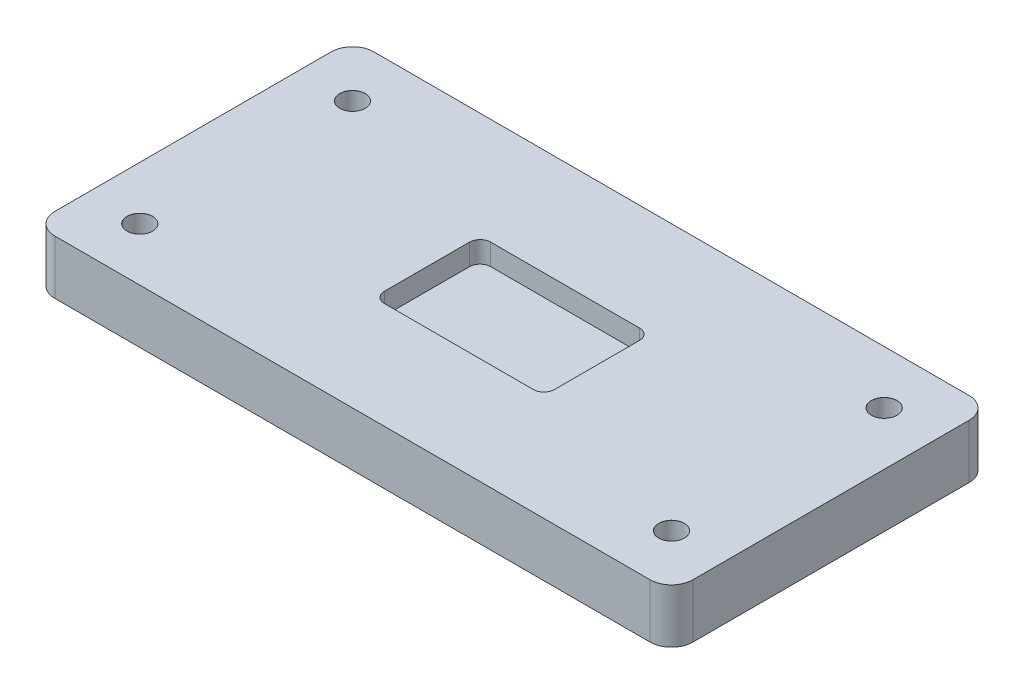
ISO-10303-21;
HEADER;
FILE_DESCRIPTION(('STEP AP214'),'2;1');
FILE_NAME('part.step','',(''),(''),'','','');
FILE_SCHEMA(('AUTOMOTIVE_DESIGN { 1 0 10303 214 1 1 1 1 }'));
ENDSEC;
DATA;
#1=APPLICATION_CONTEXT('core data for automotive mechanical design processes');
#2=APPLICATION_PROTOCOL_DEFINITION('international standard','automotive_design',2000,#1);
#3=PRODUCT_CONTEXT('',#1,'mechanical');
#4=PRODUCT('Part','Part','',(#3));
#5=PRODUCT_RELATED_PRODUCT_CATEGORY('part','',(#4));
#6=PRODUCT_DEFINITION_FORMATION('','',#4);
#7=PRODUCT_DEFINITION_CONTEXT('part definition',#1,'design');
#8=PRODUCT_DEFINITION('design','',#6,#7);
#9=PRODUCT_DEFINITION_SHAPE('','',#8);
#10=(LENGTH_UNIT() NAMED_UNIT(*) SI_UNIT(.MILLI.,.METRE.));
#11=(NAMED_UNIT(*) PLANE_ANGLE_UNIT() SI_UNIT($,.RADIAN.));
#12=(NAMED_UNIT(*) SI_UNIT($,.STERADIAN.) SOLID_ANGLE_UNIT());
#13=UNCERTAINTY_MEASURE_WITH_UNIT(LENGTH_MEASURE(1.E-05),#10,'distance_accuracy_value','');
#14=(GEOMETRIC_REPRESENTATION_CONTEXT(3) GLOBAL_UNCERTAINTY_ASSIGNED_CONTEXT((#13)) GLOBAL_UNIT_ASSIGNED_CONTEXT((#10,
#11,#12)) REPRESENTATION_CONTEXT('',''));
#15=CARTESIAN_POINT('',(0.,0.,0.));
#16=DIRECTION('',(0.,0.,1.));
#17=DIRECTION('',(1.,0.,0.));
#18=AXIS2_PLACEMENT_3D('',#15,#16,#17);
#19=CARTESIAN_POINT('',(140.,25.4,65.));
#20=DIRECTION('',(0.,-1.,0.));
#21=DIRECTION('',(0.,0.,-1.));
#22=AXIS2_PLACEMENT_3D('',#19,#20,#21);
#23=CYLINDRICAL_SURFACE('',#22,9.99999999999999);
#24=CARTESIAN_POINT('',(140.,0.,65.));
#25=DIRECTION('',(0.,1.,0.));
#26=DIRECTION('',(0.,0.,-1.));
#27=AXIS2_PLACEMENT_3D('',#24,#25,#26);
#28=CIRCLE('',#27,9.99999999999999);
#29=CARTESIAN_POINT('',(140.,0.,75.));
#30=VERTEX_POINT('',#29);
#31=CARTESIAN_POINT('',(150.,0.,64.9999999999999));
#32=VERTEX_POINT('',#31);
#33=EDGE_CURVE('E182',#30,#32,#28,.T.);
#34=ORIENTED_EDGE('',*,*,#33,.T.);
#35=DIRECTION('',(0.,-1.,0.));
#36=VECTOR('',#35,1.);
#37=CARTESIAN_POINT('',(150.,25.4,64.9999999999999));
#38=LINE('',#37,#36);
#39=CARTESIAN_POINT('',(150.,25.4,64.9999999999999));
#40=VERTEX_POINT('',#39);
#41=EDGE_CURVE('E163',#40,#32,#38,.T.);
#42=ORIENTED_EDGE('',*,*,#41,.F.);
#43=CARTESIAN_POINT('',(140.,25.4,65.));
#44=DIRECTION('',(0.,1.,0.));
#45=DIRECTION('',(0.,0.,-1.));
#46=AXIS2_PLACEMENT_3D('',#43,#44,#45);
#47=CIRCLE('',#46,9.99999999999999);
#48=CARTESIAN_POINT('',(140.,25.4,75.));
#49=VERTEX_POINT('',#48);
#50=EDGE_CURVE('E170',#49,#40,#47,.T.);
#51=ORIENTED_EDGE('',*,*,#50,.F.);
#52=DIRECTION('',(0.,-1.,0.));
#53=VECTOR('',#52,1.);
#54=CARTESIAN_POINT('',(140.,25.4,75.));
#55=LINE('',#54,#53);
#56=EDGE_CURVE('E272',#49,#30,#55,.T.);
#57=ORIENTED_EDGE('',*,*,#56,.T.);
#58=EDGE_LOOP('',(#34,#42,#51,#57));
#59=FACE_BOUND('',#58,.T.);
#60=ADVANCED_FACE('F47',(#59),#23,.T.);
#61=CARTESIAN_POINT('',(150.,25.4,-64.9999999999999));
#62=DIRECTION('',(-1.,0.,0.));
#63=DIRECTION('',(0.,0.,1.));
#64=AXIS2_PLACEMENT_3D('',#61,#62,#63);
#65=PLANE('',#64);
#66=DIRECTION('',(0.,0.,-1.));
#67=VECTOR('',#66,1.);
#68=CARTESIAN_POINT('',(150.,0.,-64.9999999999999));
#69=LINE('',#68,#67);
#70=CARTESIAN_POINT('',(150.,0.,-64.9999999999999));
#71=VERTEX_POINT('',#70);
#72=EDGE_CURVE('E274',#32,#71,#69,.T.);
#73=ORIENTED_EDGE('',*,*,#72,.T.);
#74=DIRECTION('',(0.,-1.,0.));
#75=VECTOR('',#74,1.);
#76=CARTESIAN_POINT('',(150.,25.4,-64.9999999999999));
#77=LINE('',#76,#75);
#78=CARTESIAN_POINT('',(150.,25.4,-64.9999999999999));
#79=VERTEX_POINT('',#78);
#80=EDGE_CURVE('E166',#79,#71,#77,.T.);
#81=ORIENTED_EDGE('',*,*,#80,.F.);
#82=DIRECTION('',(0.,0.,-1.));
#83=VECTOR('',#82,1.);
#84=CARTESIAN_POINT('',(150.,25.4,-64.9999999999999));
#85=LINE('',#84,#83);
#86=EDGE_CURVE('E159',#40,#79,#85,.T.);
#87=ORIENTED_EDGE('',*,*,#86,.F.);
#88=ORIENTED_EDGE('',*,*,#41,.T.);
#89=EDGE_LOOP('',(#73,#81,#87,#88));
#90=FACE_BOUND('',#89,.T.);
#91=ADVANCED_FACE('F161',(#90),#65,.F.);
#92=CARTESIAN_POINT('',(140.,25.4,-65.));
#93=DIRECTION('',(0.,-1.,0.));
#94=DIRECTION('',(0.,0.,-1.));
#95=AXIS2_PLACEMENT_3D('',#92,#93,#94);
#96=CYLINDRICAL_SURFACE('',#95,10.);
#97=CARTESIAN_POINT('',(140.,0.,-65.));
#98=DIRECTION('',(0.,1.,0.));
#99=DIRECTION('',(0.,0.,1.));
#100=AXIS2_PLACEMENT_3D('',#97,#98,#99);
#101=CIRCLE('',#100,10.);
#102=CARTESIAN_POINT('',(140.,0.,-75.));
#103=VERTEX_POINT('',#102);
#104=EDGE_CURVE('E276',#71,#103,#101,.T.);
#105=ORIENTED_EDGE('',*,*,#104,.T.);
#106=DIRECTION('',(0.,-1.,0.));
#107=VECTOR('',#106,1.);
#108=CARTESIAN_POINT('',(140.,25.4,-75.));
#109=LINE('',#108,#107);
#110=CARTESIAN_POINT('',(140.,25.4,-75.));
#111=VERTEX_POINT('',#110);
#112=EDGE_CURVE('E187',#111,#103,#109,.T.);
#113=ORIENTED_EDGE('',*,*,#112,.F.);
#114=CARTESIAN_POINT('',(140.,25.4,-65.));
#115=DIRECTION('',(0.,1.,0.));
#116=DIRECTION('',(0.,0.,1.));
#117=AXIS2_PLACEMENT_3D('',#114,#115,#116);
#118=CIRCLE('',#117,10.);
#119=EDGE_CURVE('E169',#79,#111,#118,.T.);
#120=ORIENTED_EDGE('',*,*,#119,.F.);
#121=ORIENTED_EDGE('',*,*,#80,.T.);
#122=EDGE_LOOP('',(#105,#113,#120,#121));
#123=FACE_BOUND('',#122,.T.);
#124=ADVANCED_FACE('F323',(#123),#96,.T.);
#125=CARTESIAN_POINT('',(-140.,25.4,-75.));
#126=DIRECTION('',(0.,0.,1.));
#127=DIRECTION('',(1.,0.,0.));
#128=AXIS2_PLACEMENT_3D('',#125,#126,#127);
#129=PLANE('',#128);
#130=DIRECTION('',(-1.,0.,0.));
#131=VECTOR('',#130,1.);
#132=CARTESIAN_POINT('',(-140.,0.,-75.));
#133=LINE('',#132,#131);
#134=CARTESIAN_POINT('',(-140.,0.,-75.));
#135=VERTEX_POINT('',#134);
#136=EDGE_CURVE('E278',#103,#135,#133,.T.);
#137=ORIENTED_EDGE('',*,*,#136,.T.);
#138=DIRECTION('',(0.,-1.,0.));
#139=VECTOR('',#138,1.);
#140=CARTESIAN_POINT('',(-140.,25.4,-75.));
#141=LINE('',#140,#139);
#142=CARTESIAN_POINT('',(-140.,25.4,-75.));
#143=VERTEX_POINT('',#142);
#144=EDGE_CURVE('E297',#143,#135,#141,.T.);
#145=ORIENTED_EDGE('',*,*,#144,.F.);
#146=DIRECTION('',(-1.,0.,0.));
#147=VECTOR('',#146,1.);
#148=CARTESIAN_POINT('',(-140.,25.4,-75.));
#149=LINE('',#148,#147);
#150=EDGE_CURVE('E263',#111,#143,#149,.T.);
#151=ORIENTED_EDGE('',*,*,#150,.F.);
#152=ORIENTED_EDGE('',*,*,#112,.T.);
#153=EDGE_LOOP('',(#137,#145,#151,#152));
#154=FACE_BOUND('',#153,.T.);
#155=ADVANCED_FACE('F304',(#154),#129,.F.);
#156=CARTESIAN_POINT('',(-140.,25.4,-65.));
#157=DIRECTION('',(0.,-1.,0.));
#158=DIRECTION('',(0.,0.,-1.));
#159=AXIS2_PLACEMENT_3D('',#156,#157,#158);
#160=CYLINDRICAL_SURFACE('',#159,10.);
#161=CARTESIAN_POINT('',(-140.,0.,-65.));
#162=DIRECTION('',(0.,1.,0.));
#163=DIRECTION('',(0.,0.,-1.));
#164=AXIS2_PLACEMENT_3D('',#161,#162,#163);
#165=CIRCLE('',#164,10.);
#166=CARTESIAN_POINT('',(-150.,0.,-64.9999999999999));
#167=VERTEX_POINT('',#166);
#168=EDGE_CURVE('E280',#135,#167,#165,.T.);
#169=ORIENTED_EDGE('',*,*,#168,.T.);
#170=DIRECTION('',(0.,-1.,0.));
#171=VECTOR('',#170,1.);
#172=CARTESIAN_POINT('',(-150.,25.4,-64.9999999999999));
#173=LINE('',#172,#171);
#174=CARTESIAN_POINT('',(-150.,25.4,-64.9999999999999));
#175=VERTEX_POINT('',#174);
#176=EDGE_CURVE('E294',#175,#167,#173,.T.);
#177=ORIENTED_EDGE('',*,*,#176,.F.);
#178=CARTESIAN_POINT('',(-140.,25.4,-65.));
#179=DIRECTION('',(0.,1.,0.));
#180=DIRECTION('',(0.,0.,-1.));
#181=AXIS2_PLACEMENT_3D('',#178,#179,#180);
#182=CIRCLE('',#181,10.);
#183=EDGE_CURVE('E265',#143,#175,#182,.T.);
#184=ORIENTED_EDGE('',*,*,#183,.F.);
#185=ORIENTED_EDGE('',*,*,#144,.T.);
#186=EDGE_LOOP('',(#169,#177,#184,#185));
#187=FACE_BOUND('',#186,.T.);
#188=ADVANCED_FACE('F315',(#187),#160,.T.);
#189=CARTESIAN_POINT('',(-150.,25.4,-64.9999999999999));
#190=DIRECTION('',(1.,0.,0.));
#191=DIRECTION('',(0.,0.,-1.));
#192=AXIS2_PLACEMENT_3D('',#189,#190,#191);
#193=PLANE('',#192);
#194=DIRECTION('',(0.,0.,1.));
#195=VECTOR('',#194,1.);
#196=CARTESIAN_POINT('',(-150.,0.,-64.9999999999999));
#197=LINE('',#196,#195);
#198=CARTESIAN_POINT('',(-150.,0.,65.));
#199=VERTEX_POINT('',#198);
#200=EDGE_CURVE('E282',#167,#199,#197,.T.);
#201=ORIENTED_EDGE('',*,*,#200,.T.);
#202=DIRECTION('',(0.,-1.,0.));
#203=VECTOR('',#202,1.);
#204=CARTESIAN_POINT('',(-150.,25.4,65.));
#205=LINE('',#204,#203);
#206=CARTESIAN_POINT('',(-150.,25.4,65.));
#207=VERTEX_POINT('',#206);
#208=EDGE_CURVE('E291',#207,#199,#205,.T.);
#209=ORIENTED_EDGE('',*,*,#208,.F.);
#210=DIRECTION('',(0.,0.,1.));
#211=VECTOR('',#210,1.);
#212=CARTESIAN_POINT('',(-150.,25.4,-64.9999999999999));
#213=LINE('',#212,#211);
#214=EDGE_CURVE('E267',#175,#207,#213,.T.);
#215=ORIENTED_EDGE('',*,*,#214,.F.);
#216=ORIENTED_EDGE('',*,*,#176,.T.);
#217=EDGE_LOOP('',(#201,#209,#215,#216));
#218=FACE_BOUND('',#217,.T.);
#219=ADVANCED_FACE('F319',(#218),#193,.F.);
#220=CARTESIAN_POINT('',(-140.,25.4,65.));
#221=DIRECTION('',(0.,-1.,0.));
#222=DIRECTION('',(0.,0.,-1.));
#223=AXIS2_PLACEMENT_3D('',#220,#221,#222);
#224=CYLINDRICAL_SURFACE('',#223,10.);
#225=CARTESIAN_POINT('',(-140.,0.,65.));
#226=DIRECTION('',(0.,1.,0.));
#227=DIRECTION('',(0.,0.,-1.));
#228=AXIS2_PLACEMENT_3D('',#225,#226,#227);
#229=CIRCLE('',#228,10.);
#230=CARTESIAN_POINT('',(-140.,0.,75.));
#231=VERTEX_POINT('',#230);
#232=EDGE_CURVE('E284',#199,#231,#229,.T.);
#233=ORIENTED_EDGE('',*,*,#232,.T.);
#234=DIRECTION('',(0.,-1.,0.));
#235=VECTOR('',#234,1.);
#236=CARTESIAN_POINT('',(-140.,25.4,75.));
#237=LINE('',#236,#235);
#238=CARTESIAN_POINT('',(-140.,25.4,75.));
#239=VERTEX_POINT('',#238);
#240=EDGE_CURVE('E288',#239,#231,#237,.T.);
#241=ORIENTED_EDGE('',*,*,#240,.F.);
#242=CARTESIAN_POINT('',(-140.,25.4,65.));
#243=DIRECTION('',(0.,1.,0.));
#244=DIRECTION('',(0.,0.,-1.));
#245=AXIS2_PLACEMENT_3D('',#242,#243,#244);
#246=CIRCLE('',#245,10.);
#247=EDGE_CURVE('E269',#207,#239,#246,.T.);
#248=ORIENTED_EDGE('',*,*,#247,.F.);
#249=ORIENTED_EDGE('',*,*,#208,.T.);
#250=EDGE_LOOP('',(#233,#241,#248,#249));
#251=FACE_BOUND('',#250,.T.);
#252=ADVANCED_FACE('F378',(#251),#224,.T.);
#253=CARTESIAN_POINT('',(-140.,25.4,75.));
#254=DIRECTION('',(0.,0.,-1.));
#255=DIRECTION('',(-1.,0.,0.));
#256=AXIS2_PLACEMENT_3D('',#253,#254,#255);
#257=PLANE('',#256);
#258=DIRECTION('',(1.,0.,0.));
#259=VECTOR('',#258,1.);
#260=CARTESIAN_POINT('',(-140.,0.,75.));
#261=LINE('',#260,#259);
#262=EDGE_CURVE('E179',#231,#30,#261,.T.);
#263=ORIENTED_EDGE('',*,*,#262,.T.);
#264=ORIENTED_EDGE('',*,*,#56,.F.);
#265=DIRECTION('',(1.,0.,0.));
#266=VECTOR('',#265,1.);
#267=CARTESIAN_POINT('',(-140.,25.4,75.));
#268=LINE('',#267,#266);
#269=EDGE_CURVE('E175',#239,#49,#268,.T.);
#270=ORIENTED_EDGE('',*,*,#269,.F.);
#271=ORIENTED_EDGE('',*,*,#240,.T.);
#272=EDGE_LOOP('',(#263,#264,#270,#271));
#273=FACE_BOUND('',#272,.T.);
#274=ADVANCED_FACE('F371',(#273),#257,.F.);
#275=CARTESIAN_POINT('',(140.,25.4,65.));
#276=DIRECTION('',(0.,-1.,0.));
#277=DIRECTION('',(0.,0.,-1.));
#278=AXIS2_PLACEMENT_3D('',#275,#276,#277);
#279=PLANE('',#278);
#280=CARTESIAN_POINT('',(-125.,25.4,-50.));
#281=DIRECTION('',(0.,1.,0.));
#282=DIRECTION('',(0.,0.,1.));
#283=AXIS2_PLACEMENT_3D('',#280,#281,#282);
#284=CIRCLE('',#283,6.025);
#285=CARTESIAN_POINT('',(-125.,25.4,-43.975));
#286=VERTEX_POINT('',#285);
#287=EDGE_CURVE('E682',#286,#286,#284,.T.);
#288=ORIENTED_EDGE('',*,*,#287,.F.);
#289=EDGE_LOOP('',(#288));
#290=FACE_BOUND('',#289,.T.);
#291=CARTESIAN_POINT('',(125.,25.4,-49.9999999999998));
#292=DIRECTION('',(0.,1.,0.));
#293=DIRECTION('',(0.,0.,1.));
#294=AXIS2_PLACEMENT_3D('',#291,#292,#293);
#295=CIRCLE('',#294,6.025);
#296=CARTESIAN_POINT('',(125.,25.4,-43.9749999999998));
#297=VERTEX_POINT('',#296);
#298=EDGE_CURVE('E673',#297,#297,#295,.T.);
#299=ORIENTED_EDGE('',*,*,#298,.F.);
#300=EDGE_LOOP('',(#299));
#301=FACE_BOUND('',#300,.T.);
#302=CARTESIAN_POINT('',(125.,25.4,49.9999999999998));
#303=DIRECTION('',(0.,1.,0.));
#304=DIRECTION('',(0.,0.,1.));
#305=AXIS2_PLACEMENT_3D('',#302,#303,#304);
#306=CIRCLE('',#305,6.025);
#307=CARTESIAN_POINT('',(125.,25.4,56.0249999999998));
#308=VERTEX_POINT('',#307);
#309=EDGE_CURVE('E664',#308,#308,#306,.T.);
#310=ORIENTED_EDGE('',*,*,#309,.F.);
#311=EDGE_LOOP('',(#310));
#312=FACE_BOUND('',#311,.T.);
#313=CARTESIAN_POINT('',(-125.,25.4,49.9999999999999));
#314=DIRECTION('',(0.,1.,0.));
#315=DIRECTION('',(0.,0.,1.));
#316=AXIS2_PLACEMENT_3D('',#313,#314,#315);
#317=CIRCLE('',#316,6.025);
#318=CARTESIAN_POINT('',(-125.,25.4,56.0249999999999));
#319=VERTEX_POINT('',#318);
#320=EDGE_CURVE('E654',#319,#319,#317,.T.);
#321=ORIENTED_EDGE('',*,*,#320,.F.);
#322=EDGE_LOOP('',(#321));
#323=FACE_BOUND('',#322,.T.);
#324=DIRECTION('',(-1.,0.,0.));
#325=VECTOR('',#324,1.);
#326=CARTESIAN_POINT('',(-40.,25.4,-25.));
#327=LINE('',#326,#325);
#328=CARTESIAN_POINT('',(35.,25.4,-25.));
#329=VERTEX_POINT('',#328);
#330=CARTESIAN_POINT('',(-35.,25.4,-25.));
#331=VERTEX_POINT('',#330);
#332=EDGE_CURVE('E258',#329,#331,#327,.T.);
#333=ORIENTED_EDGE('',*,*,#332,.F.);
#334=CARTESIAN_POINT('',(35.,25.4,-20.));
#335=DIRECTION('',(0.,-1.,0.));
#336=DIRECTION('',(0.,0.,-1.));
#337=AXIS2_PLACEMENT_3D('',#334,#335,#336);
#338=CIRCLE('',#337,5.);
#339=CARTESIAN_POINT('',(40.,25.4,-20.));
#340=VERTEX_POINT('',#339);
#341=EDGE_CURVE('E11',#329,#340,#338,.T.);
#342=ORIENTED_EDGE('',*,*,#341,.T.);
#343=DIRECTION('',(0.,0.,-1.));
#344=VECTOR('',#343,1.);
#345=CARTESIAN_POINT('',(40.,25.4,-25.));
#346=LINE('',#345,#344);
#347=CARTESIAN_POINT('',(40.,25.4,20.));
#348=VERTEX_POINT('',#347);
#349=EDGE_CURVE('E223',#348,#340,#346,.T.);
#350=ORIENTED_EDGE('',*,*,#349,.F.);
#351=CARTESIAN_POINT('',(35.,25.4,20.));
#352=DIRECTION('',(0.,-1.,0.));
#353=DIRECTION('',(0.,0.,-1.));
#354=AXIS2_PLACEMENT_3D('',#351,#352,#353);
#355=CIRCLE('',#354,5.);
#356=CARTESIAN_POINT('',(35.,25.4,25.));
#357=VERTEX_POINT('',#356);
#358=EDGE_CURVE('E217',#348,#357,#355,.T.);
#359=ORIENTED_EDGE('',*,*,#358,.T.);
#360=DIRECTION('',(1.,0.,0.));
#361=VECTOR('',#360,1.);
#362=CARTESIAN_POINT('',(-40.,25.4,25.));
#363=LINE('',#362,#361);
#364=CARTESIAN_POINT('',(-35.,25.4,25.));
#365=VERTEX_POINT('',#364);
#366=EDGE_CURVE('E221',#365,#357,#363,.T.);
#367=ORIENTED_EDGE('',*,*,#366,.F.);
#368=CARTESIAN_POINT('',(-35.,25.4,20.));
#369=DIRECTION('',(0.,-1.,0.));
#370=DIRECTION('',(0.,0.,-1.));
#371=AXIS2_PLACEMENT_3D('',#368,#369,#370);
#372=CIRCLE('',#371,5.);
#373=CARTESIAN_POINT('',(-40.,25.4,20.));
#374=VERTEX_POINT('',#373);
#375=EDGE_CURVE('E215',#365,#374,#372,.T.);
#376=ORIENTED_EDGE('',*,*,#375,.T.);
#377=DIRECTION('',(0.,0.,1.));
#378=VECTOR('',#377,1.);
#379=CARTESIAN_POINT('',(-40.,25.4,-25.));
#380=LINE('',#379,#378);
#381=CARTESIAN_POINT('',(-40.,25.4,-20.));
#382=VERTEX_POINT('',#381);
#383=EDGE_CURVE('E233',#382,#374,#380,.T.);
#384=ORIENTED_EDGE('',*,*,#383,.F.);
#385=CARTESIAN_POINT('',(-35.,25.4,-20.));
#386=DIRECTION('',(0.,-1.,0.));
#387=DIRECTION('',(0.,0.,-1.));
#388=AXIS2_PLACEMENT_3D('',#385,#386,#387);
#389=CIRCLE('',#388,5.);
#390=EDGE_CURVE('E55',#382,#331,#389,.T.);
#391=ORIENTED_EDGE('',*,*,#390,.T.);
#392=EDGE_LOOP('',(#333,#342,#350,#359,#367,#376,#384,#391));
#393=FACE_BOUND('',#392,.T.);
#394=ORIENTED_EDGE('',*,*,#50,.T.);
#395=ORIENTED_EDGE('',*,*,#86,.T.);
#396=ORIENTED_EDGE('',*,*,#119,.T.);
#397=ORIENTED_EDGE('',*,*,#150,.T.);
#398=ORIENTED_EDGE('',*,*,#183,.T.);
#399=ORIENTED_EDGE('',*,*,#214,.T.);
#400=ORIENTED_EDGE('',*,*,#247,.T.);
#401=ORIENTED_EDGE('',*,*,#269,.T.);
#402=EDGE_LOOP('',(#394,#395,#396,#397,#398,#399,#400,#401));
#403=FACE_BOUND('',#402,.T.);
#404=ADVANCED_FACE('F173',(#290,#301,#312,#323,#393,#403),#279,.F.);
#405=CARTESIAN_POINT('',(140.,0.,65.));
#406=DIRECTION('',(0.,-1.,0.));
#407=DIRECTION('',(0.,0.,-1.));
#408=AXIS2_PLACEMENT_3D('',#405,#406,#407);
#409=PLANE('',#408);
#410=CARTESIAN_POINT('',(-125.,0.,-50.));
#411=DIRECTION('',(0.,1.,0.));
#412=DIRECTION('',(0.,0.,1.));
#413=AXIS2_PLACEMENT_3D('',#410,#411,#412);
#414=CIRCLE('',#413,5.99999999999999);
#415=CARTESIAN_POINT('',(-125.,0.,-44.));
#416=VERTEX_POINT('',#415);
#417=EDGE_CURVE('E676',#416,#416,#414,.T.);
#418=ORIENTED_EDGE('',*,*,#417,.T.);
#419=EDGE_LOOP('',(#418));
#420=FACE_BOUND('',#419,.T.);
#421=CARTESIAN_POINT('',(125.,0.,-49.9999999999998));
#422=DIRECTION('',(0.,1.,0.));
#423=DIRECTION('',(0.,0.,1.));
#424=AXIS2_PLACEMENT_3D('',#421,#422,#423);
#425=CIRCLE('',#424,6.00000000000001);
#426=CARTESIAN_POINT('',(125.,0.,-43.9999999999998));
#427=VERTEX_POINT('',#426);
#428=EDGE_CURVE('E667',#427,#427,#425,.T.);
#429=ORIENTED_EDGE('',*,*,#428,.T.);
#430=EDGE_LOOP('',(#429));
#431=FACE_BOUND('',#430,.T.);
#432=CARTESIAN_POINT('',(125.,0.,49.9999999999998));
#433=DIRECTION('',(0.,1.,0.));
#434=DIRECTION('',(0.,0.,1.));
#435=AXIS2_PLACEMENT_3D('',#432,#433,#434);
#436=CIRCLE('',#435,6.00000000000001);
#437=CARTESIAN_POINT('',(125.,0.,55.9999999999998));
#438=VERTEX_POINT('',#437);
#439=EDGE_CURVE('E656',#438,#438,#436,.T.);
#440=ORIENTED_EDGE('',*,*,#439,.T.);
#441=EDGE_LOOP('',(#440));
#442=FACE_BOUND('',#441,.T.);
#443=CARTESIAN_POINT('',(-125.,0.,49.9999999999999));
#444=DIRECTION('',(0.,1.,0.));
#445=DIRECTION('',(0.,0.,1.));
#446=AXIS2_PLACEMENT_3D('',#443,#444,#445);
#447=CIRCLE('',#446,5.99999999999999);
#448=CARTESIAN_POINT('',(-125.,0.,55.9999999999999));
#449=VERTEX_POINT('',#448);
#450=EDGE_CURVE('E252',#449,#449,#447,.T.);
#451=ORIENTED_EDGE('',*,*,#450,.T.);
#452=EDGE_LOOP('',(#451));
#453=FACE_BOUND('',#452,.T.);
#454=ORIENTED_EDGE('',*,*,#33,.F.);
#455=ORIENTED_EDGE('',*,*,#262,.F.);
#456=ORIENTED_EDGE('',*,*,#232,.F.);
#457=ORIENTED_EDGE('',*,*,#200,.F.);
#458=ORIENTED_EDGE('',*,*,#168,.F.);
#459=ORIENTED_EDGE('',*,*,#136,.F.);
#460=ORIENTED_EDGE('',*,*,#104,.F.);
#461=ORIENTED_EDGE('',*,*,#72,.F.);
#462=EDGE_LOOP('',(#454,#455,#456,#457,#458,#459,#460,#461));
#463=FACE_BOUND('',#462,.T.);
#464=ADVANCED_FACE('F310',(#420,#431,#442,#453,#463),#409,.T.);
#465=CARTESIAN_POINT('',(40.,15.4,-25.));
#466=DIRECTION('',(1.,0.,0.));
#467=DIRECTION('',(0.,0.,-1.));
#468=AXIS2_PLACEMENT_3D('',#465,#466,#467);
#469=PLANE('',#468);
#470=DIRECTION('',(0.,0.,-1.));
#471=VECTOR('',#470,1.);
#472=CARTESIAN_POINT('',(40.,15.4,-25.));
#473=LINE('',#472,#471);
#474=CARTESIAN_POINT('',(40.,15.4,20.));
#475=VERTEX_POINT('',#474);
#476=CARTESIAN_POINT('',(40.,15.4,-20.));
#477=VERTEX_POINT('',#476);
#478=EDGE_CURVE('E232',#475,#477,#473,.T.);
#479=ORIENTED_EDGE('',*,*,#478,.F.);
#480=DIRECTION('',(0.,1.,0.));
#481=VECTOR('',#480,1.);
#482=CARTESIAN_POINT('',(40.,25.4,20.));
#483=LINE('',#482,#481);
#484=EDGE_CURVE('E208',#475,#348,#483,.T.);
#485=ORIENTED_EDGE('',*,*,#484,.T.);
#486=ORIENTED_EDGE('',*,*,#349,.T.);
#487=DIRECTION('',(0.,1.,0.));
#488=VECTOR('',#487,1.);
#489=CARTESIAN_POINT('',(40.,15.4,-20.));
#490=LINE('',#489,#488);
#491=EDGE_CURVE('E206',#340,#477,#490,.F.);
#492=ORIENTED_EDGE('',*,*,#491,.T.);
#493=EDGE_LOOP('',(#479,#485,#486,#492));
#494=FACE_BOUND('',#493,.T.);
#495=ADVANCED_FACE('F245',(#494),#469,.F.);
#496=CARTESIAN_POINT('',(-40.,15.4,25.));
#497=DIRECTION('',(0.,0.,1.));
#498=DIRECTION('',(1.,0.,0.));
#499=AXIS2_PLACEMENT_3D('',#496,#497,#498);
#500=PLANE('',#499);
#501=DIRECTION('',(1.,0.,0.));
#502=VECTOR('',#501,1.);
#503=CARTESIAN_POINT('',(-40.,15.4,25.));
#504=LINE('',#503,#502);
#505=CARTESIAN_POINT('',(-35.,15.4,25.));
#506=VERTEX_POINT('',#505);
#507=CARTESIAN_POINT('',(35.,15.4,25.));
#508=VERTEX_POINT('',#507);
#509=EDGE_CURVE('E243',#506,#508,#504,.T.);
#510=ORIENTED_EDGE('',*,*,#509,.F.);
#511=DIRECTION('',(0.,1.,0.));
#512=VECTOR('',#511,1.);
#513=CARTESIAN_POINT('',(-35.,25.4,25.));
#514=LINE('',#513,#512);
#515=EDGE_CURVE('E185',#506,#365,#514,.T.);
#516=ORIENTED_EDGE('',*,*,#515,.T.);
#517=ORIENTED_EDGE('',*,*,#366,.T.);
#518=DIRECTION('',(0.,1.,0.));
#519=VECTOR('',#518,1.);
#520=CARTESIAN_POINT('',(35.,15.4,25.));
#521=LINE('',#520,#519);
#522=EDGE_CURVE('E183',#357,#508,#521,.F.);
#523=ORIENTED_EDGE('',*,*,#522,.T.);
#524=EDGE_LOOP('',(#510,#516,#517,#523));
#525=FACE_BOUND('',#524,.T.);
#526=ADVANCED_FACE('F229',(#525),#500,.F.);
#527=CARTESIAN_POINT('',(-40.,15.4,-25.));
#528=DIRECTION('',(-1.,0.,0.));
#529=DIRECTION('',(0.,0.,1.));
#530=AXIS2_PLACEMENT_3D('',#527,#528,#529);
#531=PLANE('',#530);
#532=ORIENTED_EDGE('',*,*,#383,.T.);
#533=DIRECTION('',(0.,1.,0.));
#534=VECTOR('',#533,1.);
#535=CARTESIAN_POINT('',(-40.,15.4,20.));
#536=LINE('',#535,#534);
#537=CARTESIAN_POINT('',(-40.,15.4,20.));
#538=VERTEX_POINT('',#537);
#539=EDGE_CURVE('E196',#374,#538,#536,.F.);
#540=ORIENTED_EDGE('',*,*,#539,.T.);
#541=DIRECTION('',(0.,0.,1.));
#542=VECTOR('',#541,1.);
#543=CARTESIAN_POINT('',(-40.,15.4,-25.));
#544=LINE('',#543,#542);
#545=CARTESIAN_POINT('',(-40.,15.4,-20.));
#546=VERTEX_POINT('',#545);
#547=EDGE_CURVE('E249',#546,#538,#544,.T.);
#548=ORIENTED_EDGE('',*,*,#547,.F.);
#549=DIRECTION('',(0.,1.,0.));
#550=VECTOR('',#549,1.);
#551=CARTESIAN_POINT('',(-40.,25.4,-20.));
#552=LINE('',#551,#550);
#553=EDGE_CURVE('E193',#546,#382,#552,.T.);
#554=ORIENTED_EDGE('',*,*,#553,.T.);
#555=EDGE_LOOP('',(#532,#540,#548,#554));
#556=FACE_BOUND('',#555,.T.);
#557=ADVANCED_FACE('F354',(#556),#531,.F.);
#558=CARTESIAN_POINT('',(-40.,15.4,-25.));
#559=DIRECTION('',(0.,0.,-1.));
#560=DIRECTION('',(-1.,0.,0.));
#561=AXIS2_PLACEMENT_3D('',#558,#559,#560);
#562=PLANE('',#561);
#563=ORIENTED_EDGE('',*,*,#332,.T.);
#564=DIRECTION('',(0.,1.,0.));
#565=VECTOR('',#564,1.);
#566=CARTESIAN_POINT('',(-35.,15.4,-25.));
#567=LINE('',#566,#565);
#568=CARTESIAN_POINT('',(-35.,15.4,-25.));
#569=VERTEX_POINT('',#568);
#570=EDGE_CURVE('E213',#331,#569,#567,.F.);
#571=ORIENTED_EDGE('',*,*,#570,.T.);
#572=DIRECTION('',(-1.,0.,0.));
#573=VECTOR('',#572,1.);
#574=CARTESIAN_POINT('',(-40.,15.4,-25.));
#575=LINE('',#574,#573);
#576=CARTESIAN_POINT('',(35.,15.4,-25.));
#577=VERTEX_POINT('',#576);
#578=EDGE_CURVE('E246',#577,#569,#575,.T.);
#579=ORIENTED_EDGE('',*,*,#578,.F.);
#580=DIRECTION('',(0.,1.,0.));
#581=VECTOR('',#580,1.);
#582=CARTESIAN_POINT('',(35.,25.4,-25.));
#583=LINE('',#582,#581);
#584=EDGE_CURVE('E211',#577,#329,#583,.T.);
#585=ORIENTED_EDGE('',*,*,#584,.T.);
#586=EDGE_LOOP('',(#563,#571,#579,#585));
#587=FACE_BOUND('',#586,.T.);
#588=ADVANCED_FACE('F357',(#587),#562,.F.);
#589=CARTESIAN_POINT('',(0.,15.4,0.));
#590=DIRECTION('',(0.,1.,0.));
#591=DIRECTION('',(0.,0.,1.));
#592=AXIS2_PLACEMENT_3D('',#589,#590,#591);
#593=PLANE('',#592);
#594=ORIENTED_EDGE('',*,*,#547,.T.);
#595=CARTESIAN_POINT('',(-35.,15.4,20.));
#596=DIRECTION('',(0.,1.,0.));
#597=DIRECTION('',(0.,0.,1.));
#598=AXIS2_PLACEMENT_3D('',#595,#596,#597);
#599=CIRCLE('',#598,5.);
#600=EDGE_CURVE('E204',#538,#506,#599,.T.);
#601=ORIENTED_EDGE('',*,*,#600,.T.);
#602=ORIENTED_EDGE('',*,*,#509,.T.);
#603=CARTESIAN_POINT('',(35.,15.4,20.));
#604=DIRECTION('',(0.,1.,0.));
#605=DIRECTION('',(0.,0.,1.));
#606=AXIS2_PLACEMENT_3D('',#603,#604,#605);
#607=CIRCLE('',#606,5.);
#608=EDGE_CURVE('E202',#508,#475,#607,.T.);
#609=ORIENTED_EDGE('',*,*,#608,.T.);
#610=ORIENTED_EDGE('',*,*,#478,.T.);
#611=CARTESIAN_POINT('',(35.,15.4,-20.));
#612=DIRECTION('',(0.,1.,0.));
#613=DIRECTION('',(0.,0.,1.));
#614=AXIS2_PLACEMENT_3D('',#611,#612,#613);
#615=CIRCLE('',#614,5.);
#616=EDGE_CURVE('E198',#477,#577,#615,.T.);
#617=ORIENTED_EDGE('',*,*,#616,.T.);
#618=ORIENTED_EDGE('',*,*,#578,.T.);
#619=CARTESIAN_POINT('',(-35.,15.4,-20.));
#620=DIRECTION('',(0.,1.,0.));
#621=DIRECTION('',(0.,0.,1.));
#622=AXIS2_PLACEMENT_3D('',#619,#620,#621);
#623=CIRCLE('',#622,5.);
#624=EDGE_CURVE('E200',#569,#546,#623,.T.);
#625=ORIENTED_EDGE('',*,*,#624,.T.);
#626=EDGE_LOOP('',(#594,#601,#602,#609,#610,#617,#618,#625));
#627=FACE_BOUND('',#626,.T.);
#628=ADVANCED_FACE('F241',(#627),#593,.T.);
#629=CARTESIAN_POINT('',(-35.,15.4,20.));
#630=DIRECTION('',(0.,-1.,0.));
#631=DIRECTION('',(0.,0.,-1.));
#632=AXIS2_PLACEMENT_3D('',#629,#630,#631);
#633=CYLINDRICAL_SURFACE('',#632,5.);
#634=ORIENTED_EDGE('',*,*,#600,.F.);
#635=ORIENTED_EDGE('',*,*,#539,.F.);
#636=ORIENTED_EDGE('',*,*,#375,.F.);
#637=ORIENTED_EDGE('',*,*,#515,.F.);
#638=EDGE_LOOP('',(#634,#635,#636,#637));
#639=FACE_BOUND('',#638,.T.);
#640=ADVANCED_FACE('F336',(#639),#633,.F.);
#641=CARTESIAN_POINT('',(35.,15.4,20.));
#642=DIRECTION('',(0.,-1.,0.));
#643=DIRECTION('',(0.,0.,-1.));
#644=AXIS2_PLACEMENT_3D('',#641,#642,#643);
#645=CYLINDRICAL_SURFACE('',#644,5.);
#646=ORIENTED_EDGE('',*,*,#608,.F.);
#647=ORIENTED_EDGE('',*,*,#522,.F.);
#648=ORIENTED_EDGE('',*,*,#358,.F.);
#649=ORIENTED_EDGE('',*,*,#484,.F.);
#650=EDGE_LOOP('',(#646,#647,#648,#649));
#651=FACE_BOUND('',#650,.T.);
#652=ADVANCED_FACE('F236',(#651),#645,.F.);
#653=CARTESIAN_POINT('',(-35.,15.4,-20.));
#654=DIRECTION('',(0.,-1.,0.));
#655=DIRECTION('',(0.,0.,-1.));
#656=AXIS2_PLACEMENT_3D('',#653,#654,#655);
#657=CYLINDRICAL_SURFACE('',#656,5.);
#658=ORIENTED_EDGE('',*,*,#624,.F.);
#659=ORIENTED_EDGE('',*,*,#570,.F.);
#660=ORIENTED_EDGE('',*,*,#390,.F.);
#661=ORIENTED_EDGE('',*,*,#553,.F.);
#662=EDGE_LOOP('',(#658,#659,#660,#661));
#663=FACE_BOUND('',#662,.T.);
#664=ADVANCED_FACE('F341',(#663),#657,.F.);
#665=CARTESIAN_POINT('',(35.,15.4,-20.));
#666=DIRECTION('',(0.,-1.,0.));
#667=DIRECTION('',(0.,0.,-1.));
#668=AXIS2_PLACEMENT_3D('',#665,#666,#667);
#669=CYLINDRICAL_SURFACE('',#668,5.);
#670=ORIENTED_EDGE('',*,*,#616,.F.);
#671=ORIENTED_EDGE('',*,*,#491,.F.);
#672=ORIENTED_EDGE('',*,*,#341,.F.);
#673=ORIENTED_EDGE('',*,*,#584,.F.);
#674=EDGE_LOOP('',(#670,#671,#672,#673));
#675=FACE_BOUND('',#674,.T.);
#676=ADVANCED_FACE('F49',(#675),#669,.F.);
#677=CARTESIAN_POINT('',(-125.,25.4,49.9999999999999));
#678=DIRECTION('',(0.,1.,0.));
#679=DIRECTION('',(0.,0.,1.));
#680=AXIS2_PLACEMENT_3D('',#677,#678,#679);
#681=CYLINDRICAL_SURFACE('',#680,6.);
#682=ORIENTED_EDGE('',*,*,#450,.F.);
#683=EDGE_LOOP('',(#682));
#684=FACE_BOUND('',#683,.T.);
#685=CARTESIAN_POINT('',(-125.,25.3790225092206,49.9999999999999));
#686=DIRECTION('',(0.,1.,0.));
#687=DIRECTION('',(0.,0.,1.));
#688=AXIS2_PLACEMENT_3D('',#685,#686,#687);
#689=CIRCLE('',#688,6.00000000000001);
#690=CARTESIAN_POINT('',(-125.,25.3790225092206,55.9999999999999));
#691=VERTEX_POINT('',#690);
#692=EDGE_CURVE('E653',#691,#691,#689,.T.);
#693=ORIENTED_EDGE('',*,*,#692,.T.);
#694=EDGE_LOOP('',(#693));
#695=FACE_BOUND('',#694,.T.);
#696=ADVANCED_FACE('F346',(#684,#695),#681,.F.);
#697=CARTESIAN_POINT('',(-125.,25.4,49.9999999999999));
#698=DIRECTION('',(0.,1.,0.));
#699=DIRECTION('',(0.,0.,1.));
#700=AXIS2_PLACEMENT_3D('',#697,#698,#699);
#701=CONICAL_SURFACE('',#700,6.025,0.872664625997009);
#702=ORIENTED_EDGE('',*,*,#692,.F.);
#703=EDGE_LOOP('',(#702));
#704=FACE_BOUND('',#703,.T.);
#705=ORIENTED_EDGE('',*,*,#320,.T.);
#706=EDGE_LOOP('',(#705));
#707=FACE_BOUND('',#706,.T.);
#708=ADVANCED_FACE('F455',(#704,#707),#701,.F.);
#709=CARTESIAN_POINT('',(125.,25.4,49.9999999999998));
#710=DIRECTION('',(0.,1.,0.));
#711=DIRECTION('',(0.,0.,1.));
#712=AXIS2_PLACEMENT_3D('',#709,#710,#711);
#713=CYLINDRICAL_SURFACE('',#712,6.00000000000001);
#714=ORIENTED_EDGE('',*,*,#439,.F.);
#715=EDGE_LOOP('',(#714));
#716=FACE_BOUND('',#715,.T.);
#717=CARTESIAN_POINT('',(125.,25.3790225092206,49.9999999999998));
#718=DIRECTION('',(0.,1.,0.));
#719=DIRECTION('',(0.,0.,1.));
#720=AXIS2_PLACEMENT_3D('',#717,#718,#719);
#721=CIRCLE('',#720,6.00000000000001);
#722=CARTESIAN_POINT('',(125.,25.3790225092206,55.9999999999998));
#723=VERTEX_POINT('',#722);
#724=EDGE_CURVE('E661',#723,#723,#721,.T.);
#725=ORIENTED_EDGE('',*,*,#724,.T.);
#726=EDGE_LOOP('',(#725));
#727=FACE_BOUND('',#726,.T.);
#728=ADVANCED_FACE('F448',(#716,#727),#713,.F.);
#729=CARTESIAN_POINT('',(125.,25.4,49.9999999999998));
#730=DIRECTION('',(0.,1.,0.));
#731=DIRECTION('',(0.,0.,1.));
#732=AXIS2_PLACEMENT_3D('',#729,#730,#731);
#733=CONICAL_SURFACE('',#732,6.025,0.872664625997009);
#734=ORIENTED_EDGE('',*,*,#724,.F.);
#735=EDGE_LOOP('',(#734));
#736=FACE_BOUND('',#735,.T.);
#737=ORIENTED_EDGE('',*,*,#309,.T.);
#738=EDGE_LOOP('',(#737));
#739=FACE_BOUND('',#738,.T.);
#740=ADVANCED_FACE('F443',(#736,#739),#733,.F.);
#741=CARTESIAN_POINT('',(125.,25.4,-49.9999999999998));
#742=DIRECTION('',(0.,1.,0.));
#743=DIRECTION('',(0.,0.,1.));
#744=AXIS2_PLACEMENT_3D('',#741,#742,#743);
#745=CYLINDRICAL_SURFACE('',#744,6.00000000000001);
#746=ORIENTED_EDGE('',*,*,#428,.F.);
#747=EDGE_LOOP('',(#746));
#748=FACE_BOUND('',#747,.T.);
#749=CARTESIAN_POINT('',(125.,25.3790225092206,-49.9999999999998));
#750=DIRECTION('',(0.,1.,0.));
#751=DIRECTION('',(0.,0.,1.));
#752=AXIS2_PLACEMENT_3D('',#749,#750,#751);
#753=CIRCLE('',#752,6.00000000000001);
#754=CARTESIAN_POINT('',(125.,25.3790225092206,-43.9999999999998));
#755=VERTEX_POINT('',#754);
#756=EDGE_CURVE('E670',#755,#755,#753,.T.);
#757=ORIENTED_EDGE('',*,*,#756,.T.);
#758=EDGE_LOOP('',(#757));
#759=FACE_BOUND('',#758,.T.);
#760=ADVANCED_FACE('F436',(#748,#759),#745,.F.);
#761=CARTESIAN_POINT('',(125.,25.4,-49.9999999999998));
#762=DIRECTION('',(0.,1.,0.));
#763=DIRECTION('',(0.,0.,1.));
#764=AXIS2_PLACEMENT_3D('',#761,#762,#763);
#765=CONICAL_SURFACE('',#764,6.025,0.872664625997009);
#766=ORIENTED_EDGE('',*,*,#756,.F.);
#767=EDGE_LOOP('',(#766));
#768=FACE_BOUND('',#767,.T.);
#769=ORIENTED_EDGE('',*,*,#298,.T.);
#770=EDGE_LOOP('',(#769));
#771=FACE_BOUND('',#770,.T.);
#772=ADVANCED_FACE('F431',(#768,#771),#765,.F.);
#773=CARTESIAN_POINT('',(-125.,25.4,-50.));
#774=DIRECTION('',(0.,1.,0.));
#775=DIRECTION('',(0.,0.,1.));
#776=AXIS2_PLACEMENT_3D('',#773,#774,#775);
#777=CYLINDRICAL_SURFACE('',#776,6.);
#778=ORIENTED_EDGE('',*,*,#417,.F.);
#779=EDGE_LOOP('',(#778));
#780=FACE_BOUND('',#779,.T.);
#781=CARTESIAN_POINT('',(-125.,25.3790225092206,-50.));
#782=DIRECTION('',(0.,1.,0.));
#783=DIRECTION('',(0.,0.,1.));
#784=AXIS2_PLACEMENT_3D('',#781,#782,#783);
#785=CIRCLE('',#784,6.00000000000001);
#786=CARTESIAN_POINT('',(-125.,25.3790225092206,-44.));
#787=VERTEX_POINT('',#786);
#788=EDGE_CURVE('E679',#787,#787,#785,.T.);
#789=ORIENTED_EDGE('',*,*,#788,.T.);
#790=EDGE_LOOP('',(#789));
#791=FACE_BOUND('',#790,.T.);
#792=ADVANCED_FACE('F424',(#780,#791),#777,.F.);
#793=CARTESIAN_POINT('',(-125.,25.4,-50.));
#794=DIRECTION('',(0.,1.,0.));
#795=DIRECTION('',(0.,0.,1.));
#796=AXIS2_PLACEMENT_3D('',#793,#794,#795);
#797=CONICAL_SURFACE('',#796,6.025,0.872664625997009);
#798=ORIENTED_EDGE('',*,*,#788,.F.);
#799=EDGE_LOOP('',(#798));
#800=FACE_BOUND('',#799,.T.);
#801=ORIENTED_EDGE('',*,*,#287,.T.);
#802=EDGE_LOOP('',(#801));
#803=FACE_BOUND('',#802,.T.);
#804=ADVANCED_FACE('F420',(#800,#803),#797,.F.);
#805=CLOSED_SHELL('',(#60,#91,#124,#155,#188,#219,#252,#274,#404,#464,#495,#526,#557,#588,#628,
#640,#652,#664,#676,#696,#708,#728,#740,#760,#772,#792,#804));
#806=MANIFOLD_SOLID_BREP('B2',#805);
#807=ADVANCED_BREP_SHAPE_REPRESENTATION('',(#18,#806),#14);
#808=SHAPE_DEFINITION_REPRESENTATION(#9,#807);
ENDSEC;
END-ISO-10303-21;
